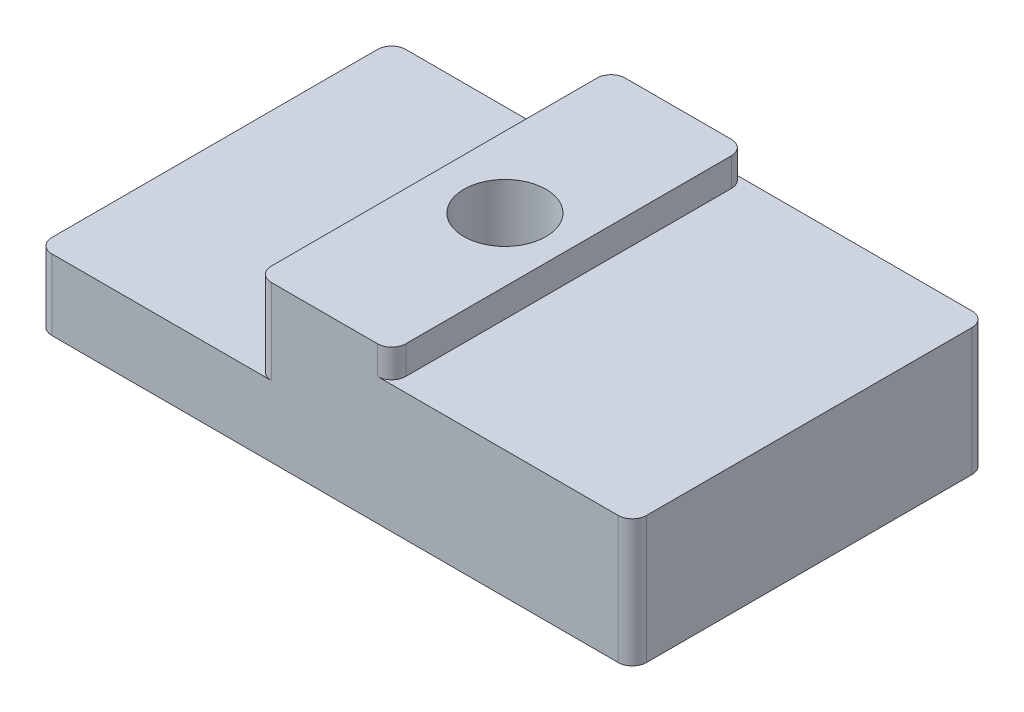
ISO-10303-21;
HEADER;
FILE_DESCRIPTION(('STEP AP214'),'2;1');
FILE_NAME('part.step','',(''),(''),'','','');
FILE_SCHEMA(('AUTOMOTIVE_DESIGN { 1 0 10303 214 1 1 1 1 }'));
ENDSEC;
DATA;
#1=APPLICATION_CONTEXT('core data for automotive mechanical design processes');
#2=APPLICATION_PROTOCOL_DEFINITION('international standard','automotive_design',2000,#1);
#3=PRODUCT_CONTEXT('',#1,'mechanical');
#4=PRODUCT('Part','Part','',(#3));
#5=PRODUCT_RELATED_PRODUCT_CATEGORY('part','',(#4));
#6=PRODUCT_DEFINITION_FORMATION('','',#4);
#7=PRODUCT_DEFINITION_CONTEXT('part definition',#1,'design');
#8=PRODUCT_DEFINITION('design','',#6,#7);
#9=PRODUCT_DEFINITION_SHAPE('','',#8);
#10=(LENGTH_UNIT() NAMED_UNIT(*) SI_UNIT(.MILLI.,.METRE.));
#11=(NAMED_UNIT(*) PLANE_ANGLE_UNIT() SI_UNIT($,.RADIAN.));
#12=(NAMED_UNIT(*) SI_UNIT($,.STERADIAN.) SOLID_ANGLE_UNIT());
#13=UNCERTAINTY_MEASURE_WITH_UNIT(LENGTH_MEASURE(1.E-05),#10,'distance_accuracy_value','');
#14=(GEOMETRIC_REPRESENTATION_CONTEXT(3) GLOBAL_UNCERTAINTY_ASSIGNED_CONTEXT((#13)) GLOBAL_UNIT_ASSIGNED_CONTEXT((#10,
#11,#12)) REPRESENTATION_CONTEXT('',''));
#15=CARTESIAN_POINT('',(0.,0.,0.));
#16=DIRECTION('',(0.,0.,1.));
#17=DIRECTION('',(1.,0.,0.));
#18=AXIS2_PLACEMENT_3D('',#15,#16,#17);
#19=CARTESIAN_POINT('',(0.,5.,0.));
#20=DIRECTION('',(0.,0.,-1.));
#21=DIRECTION('',(-1.,0.,0.));
#22=AXIS2_PLACEMENT_3D('',#19,#20,#21);
#23=PLANE('',#22);
#24=DIRECTION('',(1.,0.,0.));
#25=VECTOR('',#24,1.);
#26=CARTESIAN_POINT('',(18.5,11.,0.));
#27=LINE('',#26,#25);
#28=CARTESIAN_POINT('',(19.5,11.,0.));
#29=VERTEX_POINT('',#28);
#30=CARTESIAN_POINT('',(27.,11.,0.));
#31=VERTEX_POINT('',#30);
#32=EDGE_CURVE('E309',#29,#31,#27,.T.);
#33=ORIENTED_EDGE('',*,*,#32,.F.);
#34=DIRECTION('',(0.,-1.,0.));
#35=VECTOR('',#34,1.);
#36=CARTESIAN_POINT('',(19.5,5.,0.));
#37=LINE('',#36,#35);
#38=CARTESIAN_POINT('',(19.5,5.,0.));
#39=VERTEX_POINT('',#38);
#40=EDGE_CURVE('E184',#29,#39,#37,.T.);
#41=ORIENTED_EDGE('',*,*,#40,.T.);
#42=DIRECTION('',(1.,0.,0.));
#43=VECTOR('',#42,1.);
#44=CARTESIAN_POINT('',(0.,5.,0.));
#45=LINE('',#44,#43);
#46=CARTESIAN_POINT('',(4.,5.,0.));
#47=VERTEX_POINT('',#46);
#48=EDGE_CURVE('E165',#47,#39,#45,.T.);
#49=ORIENTED_EDGE('',*,*,#48,.F.);
#50=DIRECTION('',(0.,1.,0.));
#51=VECTOR('',#50,1.);
#52=CARTESIAN_POINT('',(4.,5.,0.));
#53=LINE('',#52,#51);
#54=CARTESIAN_POINT('',(4.,0.,0.));
#55=VERTEX_POINT('',#54);
#56=EDGE_CURVE('E181',#47,#55,#53,.F.);
#57=ORIENTED_EDGE('',*,*,#56,.T.);
#58=DIRECTION('',(1.,0.,0.));
#59=VECTOR('',#58,1.);
#60=CARTESIAN_POINT('',(0.,0.,0.));
#61=LINE('',#60,#59);
#62=CARTESIAN_POINT('',(44.,0.,0.));
#63=VERTEX_POINT('',#62);
#64=EDGE_CURVE('E326',#55,#63,#61,.T.);
#65=ORIENTED_EDGE('',*,*,#64,.T.);
#66=DIRECTION('',(0.,-1.,0.));
#67=VECTOR('',#66,1.);
#68=CARTESIAN_POINT('',(44.,5.,0.));
#69=LINE('',#68,#67);
#70=CARTESIAN_POINT('',(44.,9.,0.));
#71=VERTEX_POINT('',#70);
#72=EDGE_CURVE('E194',#63,#71,#69,.F.);
#73=ORIENTED_EDGE('',*,*,#72,.T.);
#74=DIRECTION('',(1.,0.,0.));
#75=VECTOR('',#74,1.);
#76=CARTESIAN_POINT('',(18.5,9.,0.));
#77=LINE('',#76,#75);
#78=CARTESIAN_POINT('',(27.,9.,0.));
#79=VERTEX_POINT('',#78);
#80=EDGE_CURVE('E307',#79,#71,#77,.T.);
#81=ORIENTED_EDGE('',*,*,#80,.F.);
#82=DIRECTION('',(0.,-1.,0.));
#83=VECTOR('',#82,1.);
#84=CARTESIAN_POINT('',(27.,5.,0.));
#85=LINE('',#84,#83);
#86=EDGE_CURVE('E193',#79,#31,#85,.F.);
#87=ORIENTED_EDGE('',*,*,#86,.T.);
#88=EDGE_LOOP('',(#33,#41,#49,#57,#65,#73,#81,#87));
#89=FACE_BOUND('',#88,.T.);
#90=ADVANCED_FACE('F47',(#89),#23,.F.);
#91=CARTESIAN_POINT('',(45.,5.,0.));
#92=DIRECTION('',(-1.,0.,0.));
#93=DIRECTION('',(0.,0.,1.));
#94=AXIS2_PLACEMENT_3D('',#91,#92,#93);
#95=PLANE('',#94);
#96=DIRECTION('',(0.,0.,-1.));
#97=VECTOR('',#96,1.);
#98=CARTESIAN_POINT('',(45.,9.,-25.));
#99=LINE('',#98,#97);
#100=CARTESIAN_POINT('',(45.,9.,-1.));
#101=VERTEX_POINT('',#100);
#102=CARTESIAN_POINT('',(45.,9.,-24.));
#103=VERTEX_POINT('',#102);
#104=EDGE_CURVE('E321',#101,#103,#99,.T.);
#105=ORIENTED_EDGE('',*,*,#104,.F.);
#106=DIRECTION('',(0.,-1.,0.));
#107=VECTOR('',#106,1.);
#108=CARTESIAN_POINT('',(45.,5.,-1.));
#109=LINE('',#108,#107);
#110=CARTESIAN_POINT('',(45.,0.,-1.));
#111=VERTEX_POINT('',#110);
#112=EDGE_CURVE('E265',#101,#111,#109,.T.);
#113=ORIENTED_EDGE('',*,*,#112,.T.);
#114=DIRECTION('',(0.,0.,-1.));
#115=VECTOR('',#114,1.);
#116=CARTESIAN_POINT('',(45.,0.,0.));
#117=LINE('',#116,#115);
#118=CARTESIAN_POINT('',(45.,0.,-24.));
#119=VERTEX_POINT('',#118);
#120=EDGE_CURVE('E332',#111,#119,#117,.T.);
#121=ORIENTED_EDGE('',*,*,#120,.T.);
#122=DIRECTION('',(0.,-1.,0.));
#123=VECTOR('',#122,1.);
#124=CARTESIAN_POINT('',(45.,9.,-24.));
#125=LINE('',#124,#123);
#126=EDGE_CURVE('E63',#119,#103,#125,.F.);
#127=ORIENTED_EDGE('',*,*,#126,.T.);
#128=EDGE_LOOP('',(#105,#113,#121,#127));
#129=FACE_BOUND('',#128,.T.);
#130=ADVANCED_FACE('F382',(#129),#95,.F.);
#131=CARTESIAN_POINT('',(0.,5.,-25.));
#132=DIRECTION('',(0.,0.,-1.));
#133=DIRECTION('',(-1.,0.,0.));
#134=AXIS2_PLACEMENT_3D('',#131,#132,#133);
#135=PLANE('',#134);
#136=DIRECTION('',(1.,0.,0.));
#137=VECTOR('',#136,1.);
#138=CARTESIAN_POINT('',(0.,5.,-25.));
#139=LINE('',#138,#137);
#140=CARTESIAN_POINT('',(4.,5.,-25.));
#141=VERTEX_POINT('',#140);
#142=CARTESIAN_POINT('',(19.5,5.,-25.));
#143=VERTEX_POINT('',#142);
#144=EDGE_CURVE('E186',#141,#143,#139,.T.);
#145=ORIENTED_EDGE('',*,*,#144,.T.);
#146=DIRECTION('',(0.,-1.,0.));
#147=VECTOR('',#146,1.);
#148=CARTESIAN_POINT('',(19.5,11.,-25.));
#149=LINE('',#148,#147);
#150=CARTESIAN_POINT('',(19.5,11.,-25.));
#151=VERTEX_POINT('',#150);
#152=EDGE_CURVE('E175',#143,#151,#149,.F.);
#153=ORIENTED_EDGE('',*,*,#152,.T.);
#154=DIRECTION('',(-1.,0.,0.));
#155=VECTOR('',#154,1.);
#156=CARTESIAN_POINT('',(18.5,11.,-25.));
#157=LINE('',#156,#155);
#158=CARTESIAN_POINT('',(27.,11.,-25.));
#159=VERTEX_POINT('',#158);
#160=EDGE_CURVE('E294',#159,#151,#157,.T.);
#161=ORIENTED_EDGE('',*,*,#160,.F.);
#162=DIRECTION('',(0.,-1.,0.));
#163=VECTOR('',#162,1.);
#164=CARTESIAN_POINT('',(27.,9.,-25.));
#165=LINE('',#164,#163);
#166=CARTESIAN_POINT('',(27.,9.,-25.));
#167=VERTEX_POINT('',#166);
#168=EDGE_CURVE('E238',#159,#167,#165,.T.);
#169=ORIENTED_EDGE('',*,*,#168,.T.);
#170=DIRECTION('',(-1.,0.,0.));
#171=VECTOR('',#170,1.);
#172=CARTESIAN_POINT('',(18.5,9.,-25.));
#173=LINE('',#172,#171);
#174=CARTESIAN_POINT('',(44.,9.,-25.));
#175=VERTEX_POINT('',#174);
#176=EDGE_CURVE('E324',#175,#167,#173,.T.);
#177=ORIENTED_EDGE('',*,*,#176,.F.);
#178=DIRECTION('',(0.,-1.,0.));
#179=VECTOR('',#178,1.);
#180=CARTESIAN_POINT('',(44.,0.,-25.));
#181=LINE('',#180,#179);
#182=CARTESIAN_POINT('',(44.,0.,-25.));
#183=VERTEX_POINT('',#182);
#184=EDGE_CURVE('E230',#175,#183,#181,.T.);
#185=ORIENTED_EDGE('',*,*,#184,.T.);
#186=DIRECTION('',(1.,0.,0.));
#187=VECTOR('',#186,1.);
#188=CARTESIAN_POINT('',(0.,0.,-25.));
#189=LINE('',#188,#187);
#190=CARTESIAN_POINT('',(4.,0.,-25.));
#191=VERTEX_POINT('',#190);
#192=EDGE_CURVE('E187',#191,#183,#189,.T.);
#193=ORIENTED_EDGE('',*,*,#192,.F.);
#194=DIRECTION('',(0.,1.,0.));
#195=VECTOR('',#194,1.);
#196=CARTESIAN_POINT('',(4.,5.,-25.));
#197=LINE('',#196,#195);
#198=EDGE_CURVE('E234',#191,#141,#197,.T.);
#199=ORIENTED_EDGE('',*,*,#198,.T.);
#200=EDGE_LOOP('',(#145,#153,#161,#169,#177,#185,#193,#199));
#201=FACE_BOUND('',#200,.T.);
#202=ADVANCED_FACE('F293',(#201),#135,.T.);
#203=CARTESIAN_POINT('',(0.,5.,0.));
#204=DIRECTION('',(0.,1.,0.));
#205=DIRECTION('',(0.,0.,1.));
#206=AXIS2_PLACEMENT_3D('',#203,#204,#205);
#207=PLANE('',#206);
#208=ORIENTED_EDGE('',*,*,#144,.F.);
#209=CARTESIAN_POINT('',(4.,5.,-24.));
#210=DIRECTION('',(0.,1.,0.));
#211=DIRECTION('',(0.,0.,1.));
#212=AXIS2_PLACEMENT_3D('',#209,#210,#211);
#213=CIRCLE('',#212,1.);
#214=CARTESIAN_POINT('',(3.,5.,-24.));
#215=VERTEX_POINT('',#214);
#216=EDGE_CURVE('E174',#141,#215,#213,.T.);
#217=ORIENTED_EDGE('',*,*,#216,.T.);
#218=DIRECTION('',(0.,0.,-1.));
#219=VECTOR('',#218,1.);
#220=CARTESIAN_POINT('',(3.,5.,-25.));
#221=LINE('',#220,#219);
#222=CARTESIAN_POINT('',(3.,5.,-1.));
#223=VERTEX_POINT('',#222);
#224=EDGE_CURVE('E168',#223,#215,#221,.T.);
#225=ORIENTED_EDGE('',*,*,#224,.F.);
#226=CARTESIAN_POINT('',(4.,5.,-1.));
#227=DIRECTION('',(0.,1.,0.));
#228=DIRECTION('',(0.,0.,1.));
#229=AXIS2_PLACEMENT_3D('',#226,#227,#228);
#230=CIRCLE('',#229,1.);
#231=EDGE_CURVE('E161',#223,#47,#230,.T.);
#232=ORIENTED_EDGE('',*,*,#231,.T.);
#233=ORIENTED_EDGE('',*,*,#48,.T.);
#234=CARTESIAN_POINT('',(19.5,5.,-1.));
#235=DIRECTION('',(0.,1.,0.));
#236=DIRECTION('',(0.,0.,1.));
#237=AXIS2_PLACEMENT_3D('',#234,#235,#236);
#238=CIRCLE('',#237,1.);
#239=CARTESIAN_POINT('',(18.5,5.,-1.));
#240=VERTEX_POINT('',#239);
#241=EDGE_CURVE('E274',#39,#240,#238,.F.);
#242=ORIENTED_EDGE('',*,*,#241,.T.);
#243=DIRECTION('',(0.,0.,1.));
#244=VECTOR('',#243,1.);
#245=CARTESIAN_POINT('',(18.5,5.,-25.));
#246=LINE('',#245,#244);
#247=CARTESIAN_POINT('',(18.5,5.,-24.));
#248=VERTEX_POINT('',#247);
#249=EDGE_CURVE('E285',#248,#240,#246,.T.);
#250=ORIENTED_EDGE('',*,*,#249,.F.);
#251=CARTESIAN_POINT('',(19.5,5.,-24.));
#252=DIRECTION('',(0.,1.,0.));
#253=DIRECTION('',(0.,0.,1.));
#254=AXIS2_PLACEMENT_3D('',#251,#252,#253);
#255=CIRCLE('',#254,1.);
#256=EDGE_CURVE('E56',#248,#143,#255,.F.);
#257=ORIENTED_EDGE('',*,*,#256,.T.);
#258=EDGE_LOOP('',(#208,#217,#225,#232,#233,#242,#250,#257));
#259=FACE_BOUND('',#258,.T.);
#260=ADVANCED_FACE('F164',(#259),#207,.T.);
#261=CARTESIAN_POINT('',(0.,0.,0.));
#262=DIRECTION('',(0.,1.,0.));
#263=DIRECTION('',(0.,0.,1.));
#264=AXIS2_PLACEMENT_3D('',#261,#262,#263);
#265=PLANE('',#264);
#266=CARTESIAN_POINT('',(23.5,0.,-12.5));
#267=DIRECTION('',(0.,-1.,0.));
#268=DIRECTION('',(0.,0.,-1.));
#269=AXIS2_PLACEMENT_3D('',#266,#267,#268);
#270=CIRCLE('',#269,2.9);
#271=CARTESIAN_POINT('',(23.5,0.,-15.4));
#272=VERTEX_POINT('',#271);
#273=EDGE_CURVE('E358',#272,#272,#270,.T.);
#274=ORIENTED_EDGE('',*,*,#273,.F.);
#275=EDGE_LOOP('',(#274));
#276=FACE_BOUND('',#275,.T.);
#277=DIRECTION('',(0.,0.,-1.));
#278=VECTOR('',#277,1.);
#279=CARTESIAN_POINT('',(3.,0.,-25.));
#280=LINE('',#279,#278);
#281=CARTESIAN_POINT('',(3.,0.,-1.));
#282=VERTEX_POINT('',#281);
#283=CARTESIAN_POINT('',(3.,0.,-24.));
#284=VERTEX_POINT('',#283);
#285=EDGE_CURVE('E318',#282,#284,#280,.T.);
#286=ORIENTED_EDGE('',*,*,#285,.T.);
#287=CARTESIAN_POINT('',(4.,0.,-24.));
#288=DIRECTION('',(0.,1.,0.));
#289=DIRECTION('',(0.,0.,1.));
#290=AXIS2_PLACEMENT_3D('',#287,#288,#289);
#291=CIRCLE('',#290,1.);
#292=EDGE_CURVE('E260',#284,#191,#291,.F.);
#293=ORIENTED_EDGE('',*,*,#292,.T.);
#294=ORIENTED_EDGE('',*,*,#192,.T.);
#295=CARTESIAN_POINT('',(44.,0.,-24.));
#296=DIRECTION('',(0.,1.,0.));
#297=DIRECTION('',(0.,0.,1.));
#298=AXIS2_PLACEMENT_3D('',#295,#296,#297);
#299=CIRCLE('',#298,1.);
#300=EDGE_CURVE('E252',#183,#119,#299,.F.);
#301=ORIENTED_EDGE('',*,*,#300,.T.);
#302=ORIENTED_EDGE('',*,*,#120,.F.);
#303=CARTESIAN_POINT('',(44.,0.,-1.));
#304=DIRECTION('',(0.,1.,0.));
#305=DIRECTION('',(0.,0.,1.));
#306=AXIS2_PLACEMENT_3D('',#303,#304,#305);
#307=CIRCLE('',#306,1.);
#308=EDGE_CURVE('E255',#111,#63,#307,.F.);
#309=ORIENTED_EDGE('',*,*,#308,.T.);
#310=ORIENTED_EDGE('',*,*,#64,.F.);
#311=CARTESIAN_POINT('',(4.,0.,-1.));
#312=DIRECTION('',(0.,1.,0.));
#313=DIRECTION('',(0.,0.,1.));
#314=AXIS2_PLACEMENT_3D('',#311,#312,#313);
#315=CIRCLE('',#314,1.);
#316=EDGE_CURVE('E191',#55,#282,#315,.F.);
#317=ORIENTED_EDGE('',*,*,#316,.T.);
#318=EDGE_LOOP('',(#286,#293,#294,#301,#302,#309,#310,#317));
#319=FACE_BOUND('',#318,.T.);
#320=ADVANCED_FACE('F339',(#276,#319),#265,.F.);
#321=CARTESIAN_POINT('',(18.5,9.,-25.));
#322=DIRECTION('',(1.,0.,0.));
#323=DIRECTION('',(0.,0.,-1.));
#324=AXIS2_PLACEMENT_3D('',#321,#322,#323);
#325=PLANE('',#324);
#326=ORIENTED_EDGE('',*,*,#249,.T.);
#327=DIRECTION('',(0.,-1.,0.));
#328=VECTOR('',#327,1.);
#329=CARTESIAN_POINT('',(18.5,9.,-1.));
#330=LINE('',#329,#328);
#331=CARTESIAN_POINT('',(18.5,11.,-1.));
#332=VERTEX_POINT('',#331);
#333=EDGE_CURVE('E208',#240,#332,#330,.F.);
#334=ORIENTED_EDGE('',*,*,#333,.T.);
#335=DIRECTION('',(0.,0.,1.));
#336=VECTOR('',#335,1.);
#337=CARTESIAN_POINT('',(18.5,11.,-25.));
#338=LINE('',#337,#336);
#339=CARTESIAN_POINT('',(18.5,11.,-24.));
#340=VERTEX_POINT('',#339);
#341=EDGE_CURVE('E317',#340,#332,#338,.T.);
#342=ORIENTED_EDGE('',*,*,#341,.F.);
#343=DIRECTION('',(0.,-1.,0.));
#344=VECTOR('',#343,1.);
#345=CARTESIAN_POINT('',(18.5,5.,-24.));
#346=LINE('',#345,#344);
#347=EDGE_CURVE('E204',#340,#248,#346,.T.);
#348=ORIENTED_EDGE('',*,*,#347,.T.);
#349=EDGE_LOOP('',(#326,#334,#342,#348));
#350=FACE_BOUND('',#349,.T.);
#351=ADVANCED_FACE('F491',(#350),#325,.F.);
#352=CARTESIAN_POINT('',(0.,9.,0.));
#353=DIRECTION('',(0.,1.,0.));
#354=DIRECTION('',(0.,0.,1.));
#355=AXIS2_PLACEMENT_3D('',#352,#353,#354);
#356=PLANE('',#355);
#357=ORIENTED_EDGE('',*,*,#80,.T.);
#358=CARTESIAN_POINT('',(44.,9.,-1.));
#359=DIRECTION('',(0.,1.,0.));
#360=DIRECTION('',(0.,0.,1.));
#361=AXIS2_PLACEMENT_3D('',#358,#359,#360);
#362=CIRCLE('',#361,1.);
#363=EDGE_CURVE('E70',#71,#101,#362,.T.);
#364=ORIENTED_EDGE('',*,*,#363,.T.);
#365=ORIENTED_EDGE('',*,*,#104,.T.);
#366=CARTESIAN_POINT('',(44.,9.,-24.));
#367=DIRECTION('',(0.,1.,0.));
#368=DIRECTION('',(0.,0.,1.));
#369=AXIS2_PLACEMENT_3D('',#366,#367,#368);
#370=CIRCLE('',#369,1.);
#371=EDGE_CURVE('E269',#103,#175,#370,.T.);
#372=ORIENTED_EDGE('',*,*,#371,.T.);
#373=ORIENTED_EDGE('',*,*,#176,.T.);
#374=CARTESIAN_POINT('',(27.,9.,-24.));
#375=DIRECTION('',(0.,1.,0.));
#376=DIRECTION('',(0.,0.,1.));
#377=AXIS2_PLACEMENT_3D('',#374,#375,#376);
#378=CIRCLE('',#377,1.);
#379=CARTESIAN_POINT('',(28.,9.,-24.));
#380=VERTEX_POINT('',#379);
#381=EDGE_CURVE('E11',#167,#380,#378,.F.);
#382=ORIENTED_EDGE('',*,*,#381,.T.);
#383=DIRECTION('',(0.,0.,-1.));
#384=VECTOR('',#383,1.);
#385=CARTESIAN_POINT('',(28.,9.,-25.));
#386=LINE('',#385,#384);
#387=CARTESIAN_POINT('',(28.,9.,-1.));
#388=VERTEX_POINT('',#387);
#389=EDGE_CURVE('E313',#388,#380,#386,.T.);
#390=ORIENTED_EDGE('',*,*,#389,.F.);
#391=CARTESIAN_POINT('',(27.,9.,-1.));
#392=DIRECTION('',(0.,1.,0.));
#393=DIRECTION('',(0.,0.,1.));
#394=AXIS2_PLACEMENT_3D('',#391,#392,#393);
#395=CIRCLE('',#394,1.);
#396=EDGE_CURVE('E277',#388,#79,#395,.F.);
#397=ORIENTED_EDGE('',*,*,#396,.T.);
#398=EDGE_LOOP('',(#357,#364,#365,#372,#373,#382,#390,#397));
#399=FACE_BOUND('',#398,.T.);
#400=ADVANCED_FACE('F375',(#399),#356,.T.);
#401=CARTESIAN_POINT('',(28.,11.,-25.));
#402=DIRECTION('',(-1.,0.,0.));
#403=DIRECTION('',(0.,0.,1.));
#404=AXIS2_PLACEMENT_3D('',#401,#402,#403);
#405=PLANE('',#404);
#406=DIRECTION('',(0.,0.,-1.));
#407=VECTOR('',#406,1.);
#408=CARTESIAN_POINT('',(28.,11.,-25.));
#409=LINE('',#408,#407);
#410=CARTESIAN_POINT('',(28.,11.,-1.));
#411=VERTEX_POINT('',#410);
#412=CARTESIAN_POINT('',(28.,11.,-24.));
#413=VERTEX_POINT('',#412);
#414=EDGE_CURVE('E303',#411,#413,#409,.T.);
#415=ORIENTED_EDGE('',*,*,#414,.F.);
#416=DIRECTION('',(0.,-1.,0.));
#417=VECTOR('',#416,1.);
#418=CARTESIAN_POINT('',(28.,11.,-1.));
#419=LINE('',#418,#417);
#420=EDGE_CURVE('E226',#411,#388,#419,.T.);
#421=ORIENTED_EDGE('',*,*,#420,.T.);
#422=ORIENTED_EDGE('',*,*,#389,.T.);
#423=DIRECTION('',(0.,-1.,0.));
#424=VECTOR('',#423,1.);
#425=CARTESIAN_POINT('',(28.,11.,-24.));
#426=LINE('',#425,#424);
#427=EDGE_CURVE('E223',#380,#413,#426,.F.);
#428=ORIENTED_EDGE('',*,*,#427,.T.);
#429=EDGE_LOOP('',(#415,#421,#422,#428));
#430=FACE_BOUND('',#429,.T.);
#431=ADVANCED_FACE('F373',(#430),#405,.F.);
#432=CARTESIAN_POINT('',(0.,11.,0.));
#433=DIRECTION('',(0.,1.,0.));
#434=DIRECTION('',(0.,0.,1.));
#435=AXIS2_PLACEMENT_3D('',#432,#433,#434);
#436=PLANE('',#435);
#437=CARTESIAN_POINT('',(23.5,11.,-12.5));
#438=DIRECTION('',(0.,-1.,0.));
#439=DIRECTION('',(0.,0.,-1.));
#440=AXIS2_PLACEMENT_3D('',#437,#438,#439);
#441=CIRCLE('',#440,2.9);
#442=CARTESIAN_POINT('',(23.5,11.,-15.4));
#443=VERTEX_POINT('',#442);
#444=EDGE_CURVE('E352',#443,#443,#441,.T.);
#445=ORIENTED_EDGE('',*,*,#444,.T.);
#446=EDGE_LOOP('',(#445));
#447=FACE_BOUND('',#446,.T.);
#448=ORIENTED_EDGE('',*,*,#341,.T.);
#449=CARTESIAN_POINT('',(19.5,11.,-1.));
#450=DIRECTION('',(0.,1.,0.));
#451=DIRECTION('',(0.,0.,1.));
#452=AXIS2_PLACEMENT_3D('',#449,#450,#451);
#453=CIRCLE('',#452,1.);
#454=EDGE_CURVE('E220',#332,#29,#453,.T.);
#455=ORIENTED_EDGE('',*,*,#454,.T.);
#456=ORIENTED_EDGE('',*,*,#32,.T.);
#457=CARTESIAN_POINT('',(27.,11.,-1.));
#458=DIRECTION('',(0.,1.,0.));
#459=DIRECTION('',(0.,0.,1.));
#460=AXIS2_PLACEMENT_3D('',#457,#458,#459);
#461=CIRCLE('',#460,1.);
#462=EDGE_CURVE('E217',#31,#411,#461,.T.);
#463=ORIENTED_EDGE('',*,*,#462,.T.);
#464=ORIENTED_EDGE('',*,*,#414,.T.);
#465=CARTESIAN_POINT('',(27.,11.,-24.));
#466=DIRECTION('',(0.,1.,0.));
#467=DIRECTION('',(0.,0.,1.));
#468=AXIS2_PLACEMENT_3D('',#465,#466,#467);
#469=CIRCLE('',#468,1.);
#470=EDGE_CURVE('E211',#413,#159,#469,.T.);
#471=ORIENTED_EDGE('',*,*,#470,.T.);
#472=ORIENTED_EDGE('',*,*,#160,.T.);
#473=CARTESIAN_POINT('',(19.5,11.,-24.));
#474=DIRECTION('',(0.,1.,0.));
#475=DIRECTION('',(0.,0.,1.));
#476=AXIS2_PLACEMENT_3D('',#473,#474,#475);
#477=CIRCLE('',#476,1.);
#478=EDGE_CURVE('E214',#151,#340,#477,.T.);
#479=ORIENTED_EDGE('',*,*,#478,.T.);
#480=EDGE_LOOP('',(#448,#455,#456,#463,#464,#471,#472,#479));
#481=FACE_BOUND('',#480,.T.);
#482=ADVANCED_FACE('F298',(#447,#481),#436,.T.);
#483=CARTESIAN_POINT('',(3.,0.,-25.));
#484=DIRECTION('',(1.,0.,0.));
#485=DIRECTION('',(0.,0.,-1.));
#486=AXIS2_PLACEMENT_3D('',#483,#484,#485);
#487=PLANE('',#486);
#488=ORIENTED_EDGE('',*,*,#224,.T.);
#489=DIRECTION('',(0.,1.,0.));
#490=VECTOR('',#489,1.);
#491=CARTESIAN_POINT('',(3.,0.,-24.));
#492=LINE('',#491,#490);
#493=EDGE_CURVE('E249',#215,#284,#492,.F.);
#494=ORIENTED_EDGE('',*,*,#493,.T.);
#495=ORIENTED_EDGE('',*,*,#285,.F.);
#496=DIRECTION('',(0.,1.,0.));
#497=VECTOR('',#496,1.);
#498=CARTESIAN_POINT('',(3.,0.,-1.));
#499=LINE('',#498,#497);
#500=EDGE_CURVE('E246',#282,#223,#499,.T.);
#501=ORIENTED_EDGE('',*,*,#500,.T.);
#502=EDGE_LOOP('',(#488,#494,#495,#501));
#503=FACE_BOUND('',#502,.T.);
#504=ADVANCED_FACE('F349',(#503),#487,.F.);
#505=CARTESIAN_POINT('',(23.5,0.,-12.5));
#506=DIRECTION('',(0.,-1.,0.));
#507=DIRECTION('',(0.,0.,-1.));
#508=AXIS2_PLACEMENT_3D('',#505,#506,#507);
#509=CYLINDRICAL_SURFACE('',#508,2.9);
#510=ORIENTED_EDGE('',*,*,#444,.F.);
#511=EDGE_LOOP('',(#510));
#512=FACE_BOUND('',#511,.T.);
#513=ORIENTED_EDGE('',*,*,#273,.T.);
#514=EDGE_LOOP('',(#513));
#515=FACE_BOUND('',#514,.T.);
#516=ADVANCED_FACE('F404',(#512,#515),#509,.F.);
#517=CARTESIAN_POINT('',(19.5,5.,-1.));
#518=DIRECTION('',(0.,-1.,0.));
#519=DIRECTION('',(0.,0.,-1.));
#520=AXIS2_PLACEMENT_3D('',#517,#518,#519);
#521=CYLINDRICAL_SURFACE('',#520,1.);
#522=ORIENTED_EDGE('',*,*,#454,.F.);
#523=ORIENTED_EDGE('',*,*,#333,.F.);
#524=ORIENTED_EDGE('',*,*,#241,.F.);
#525=ORIENTED_EDGE('',*,*,#40,.F.);
#526=EDGE_LOOP('',(#522,#523,#524,#525));
#527=FACE_BOUND('',#526,.T.);
#528=ADVANCED_FACE('F401',(#527),#521,.T.);
#529=CARTESIAN_POINT('',(27.,11.,-1.));
#530=DIRECTION('',(0.,-1.,0.));
#531=DIRECTION('',(0.,0.,-1.));
#532=AXIS2_PLACEMENT_3D('',#529,#530,#531);
#533=CYLINDRICAL_SURFACE('',#532,1.);
#534=ORIENTED_EDGE('',*,*,#462,.F.);
#535=ORIENTED_EDGE('',*,*,#86,.F.);
#536=ORIENTED_EDGE('',*,*,#396,.F.);
#537=ORIENTED_EDGE('',*,*,#420,.F.);
#538=EDGE_LOOP('',(#534,#535,#536,#537));
#539=FACE_BOUND('',#538,.T.);
#540=ADVANCED_FACE('F370',(#539),#533,.T.);
#541=CARTESIAN_POINT('',(19.5,9.,-24.));
#542=DIRECTION('',(0.,1.,0.));
#543=DIRECTION('',(0.,0.,1.));
#544=AXIS2_PLACEMENT_3D('',#541,#542,#543);
#545=CYLINDRICAL_SURFACE('',#544,1.);
#546=ORIENTED_EDGE('',*,*,#478,.F.);
#547=ORIENTED_EDGE('',*,*,#152,.F.);
#548=ORIENTED_EDGE('',*,*,#256,.F.);
#549=ORIENTED_EDGE('',*,*,#347,.F.);
#550=EDGE_LOOP('',(#546,#547,#548,#549));
#551=FACE_BOUND('',#550,.T.);
#552=ADVANCED_FACE('F289',(#551),#545,.T.);
#553=CARTESIAN_POINT('',(27.,5.,-24.));
#554=DIRECTION('',(0.,1.,0.));
#555=DIRECTION('',(0.,0.,1.));
#556=AXIS2_PLACEMENT_3D('',#553,#554,#555);
#557=CYLINDRICAL_SURFACE('',#556,1.);
#558=ORIENTED_EDGE('',*,*,#470,.F.);
#559=ORIENTED_EDGE('',*,*,#427,.F.);
#560=ORIENTED_EDGE('',*,*,#381,.F.);
#561=ORIENTED_EDGE('',*,*,#168,.F.);
#562=EDGE_LOOP('',(#558,#559,#560,#561));
#563=FACE_BOUND('',#562,.T.);
#564=ADVANCED_FACE('F378',(#563),#557,.T.);
#565=CARTESIAN_POINT('',(4.,5.,-24.));
#566=DIRECTION('',(0.,-1.,0.));
#567=DIRECTION('',(0.,0.,-1.));
#568=AXIS2_PLACEMENT_3D('',#565,#566,#567);
#569=CYLINDRICAL_SURFACE('',#568,1.);
#570=ORIENTED_EDGE('',*,*,#292,.F.);
#571=ORIENTED_EDGE('',*,*,#493,.F.);
#572=ORIENTED_EDGE('',*,*,#216,.F.);
#573=ORIENTED_EDGE('',*,*,#198,.F.);
#574=EDGE_LOOP('',(#570,#571,#572,#573));
#575=FACE_BOUND('',#574,.T.);
#576=ADVANCED_FACE('F346',(#575),#569,.T.);
#577=CARTESIAN_POINT('',(4.,0.,-1.));
#578=DIRECTION('',(0.,1.,0.));
#579=DIRECTION('',(0.,0.,1.));
#580=AXIS2_PLACEMENT_3D('',#577,#578,#579);
#581=CYLINDRICAL_SURFACE('',#580,1.);
#582=ORIENTED_EDGE('',*,*,#316,.F.);
#583=ORIENTED_EDGE('',*,*,#56,.F.);
#584=ORIENTED_EDGE('',*,*,#231,.F.);
#585=ORIENTED_EDGE('',*,*,#500,.F.);
#586=EDGE_LOOP('',(#582,#583,#584,#585));
#587=FACE_BOUND('',#586,.T.);
#588=ADVANCED_FACE('F190',(#587),#581,.T.);
#589=CARTESIAN_POINT('',(44.,5.,-1.));
#590=DIRECTION('',(0.,-1.,0.));
#591=DIRECTION('',(0.,0.,-1.));
#592=AXIS2_PLACEMENT_3D('',#589,#590,#591);
#593=CYLINDRICAL_SURFACE('',#592,1.);
#594=ORIENTED_EDGE('',*,*,#363,.F.);
#595=ORIENTED_EDGE('',*,*,#72,.F.);
#596=ORIENTED_EDGE('',*,*,#308,.F.);
#597=ORIENTED_EDGE('',*,*,#112,.F.);
#598=EDGE_LOOP('',(#594,#595,#596,#597));
#599=FACE_BOUND('',#598,.T.);
#600=ADVANCED_FACE('F384',(#599),#593,.T.);
#601=CARTESIAN_POINT('',(44.,5.,-24.));
#602=DIRECTION('',(0.,1.,0.));
#603=DIRECTION('',(0.,0.,1.));
#604=AXIS2_PLACEMENT_3D('',#601,#602,#603);
#605=CYLINDRICAL_SURFACE('',#604,1.);
#606=ORIENTED_EDGE('',*,*,#371,.F.);
#607=ORIENTED_EDGE('',*,*,#126,.F.);
#608=ORIENTED_EDGE('',*,*,#300,.F.);
#609=ORIENTED_EDGE('',*,*,#184,.F.);
#610=EDGE_LOOP('',(#606,#607,#608,#609));
#611=FACE_BOUND('',#610,.T.);
#612=ADVANCED_FACE('F49',(#611),#605,.T.);
#613=CLOSED_SHELL('',(#90,#130,#202,#260,#320,#351,#400,#431,#482,#504,#516,#528,#540,#552,#564,
#576,#588,#600,#612));
#614=MANIFOLD_SOLID_BREP('B2',#613);
#615=ADVANCED_BREP_SHAPE_REPRESENTATION('',(#18,#614),#14);
#616=SHAPE_DEFINITION_REPRESENTATION(#9,#615);
ENDSEC;
END-ISO-10303-21;
